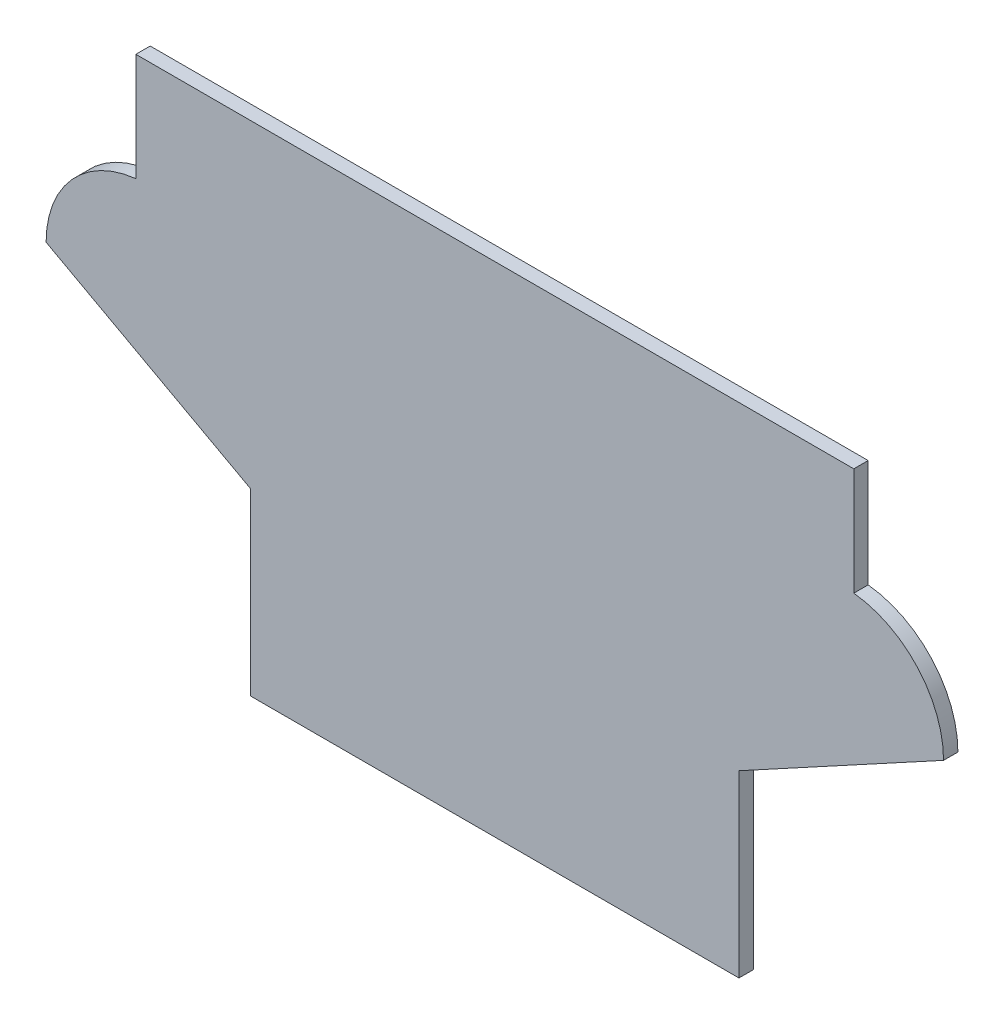
ISO-10303-21;
HEADER;
FILE_DESCRIPTION(('STEP AP214'),'2;1');
FILE_NAME('part.step','',(''),(''),'','','');
FILE_SCHEMA(('AUTOMOTIVE_DESIGN { 1 0 10303 214 1 1 1 1 }'));
ENDSEC;
DATA;
#1=APPLICATION_CONTEXT('core data for automotive mechanical design processes');
#2=APPLICATION_PROTOCOL_DEFINITION('international standard','automotive_design',2000,#1);
#3=PRODUCT_CONTEXT('',#1,'mechanical');
#4=PRODUCT('Part','Part','',(#3));
#5=PRODUCT_RELATED_PRODUCT_CATEGORY('part','',(#4));
#6=PRODUCT_DEFINITION_FORMATION('','',#4);
#7=PRODUCT_DEFINITION_CONTEXT('part definition',#1,'design');
#8=PRODUCT_DEFINITION('design','',#6,#7);
#9=PRODUCT_DEFINITION_SHAPE('','',#8);
#10=(LENGTH_UNIT() NAMED_UNIT(*) SI_UNIT(.MILLI.,.METRE.));
#11=(NAMED_UNIT(*) PLANE_ANGLE_UNIT() SI_UNIT($,.RADIAN.));
#12=(NAMED_UNIT(*) SI_UNIT($,.STERADIAN.) SOLID_ANGLE_UNIT());
#13=UNCERTAINTY_MEASURE_WITH_UNIT(LENGTH_MEASURE(1.E-05),#10,'distance_accuracy_value','');
#14=(GEOMETRIC_REPRESENTATION_CONTEXT(3) GLOBAL_UNCERTAINTY_ASSIGNED_CONTEXT((#13)) GLOBAL_UNIT_ASSIGNED_CONTEXT((#10,
#11,#12)) REPRESENTATION_CONTEXT('',''));
#15=CARTESIAN_POINT('',(0.,0.,0.));
#16=DIRECTION('',(0.,0.,1.));
#17=DIRECTION('',(1.,0.,0.));
#18=AXIS2_PLACEMENT_3D('',#15,#16,#17);
#19=CARTESIAN_POINT('',(500.,544.194109070751,20.));
#20=DIRECTION('',(-1.,0.,0.));
#21=DIRECTION('',(0.,0.,1.));
#22=AXIS2_PLACEMENT_3D('',#19,#20,#21);
#23=PLANE('',#22);
#24=DIRECTION('',(0.,1.,0.));
#25=VECTOR('',#24,1.);
#26=CARTESIAN_POINT('',(500.,544.194109070751,0.));
#27=LINE('',#26,#25);
#28=CARTESIAN_POINT('',(500.,544.194109070751,0.));
#29=VERTEX_POINT('',#28);
#30=CARTESIAN_POINT('',(500.,694.194109070751,0.));
#31=VERTEX_POINT('',#30);
#32=EDGE_CURVE('E142',#29,#31,#27,.T.);
#33=ORIENTED_EDGE('',*,*,#32,.T.);
#34=DIRECTION('',(0.,0.,-1.));
#35=VECTOR('',#34,1.);
#36=CARTESIAN_POINT('',(500.,694.194109070751,20.));
#37=LINE('',#36,#35);
#38=CARTESIAN_POINT('',(500.,694.194109070751,20.));
#39=VERTEX_POINT('',#38);
#40=EDGE_CURVE('E11',#39,#31,#37,.T.);
#41=ORIENTED_EDGE('',*,*,#40,.F.);
#42=DIRECTION('',(0.,1.,0.));
#43=VECTOR('',#42,1.);
#44=CARTESIAN_POINT('',(500.,544.194109070751,20.));
#45=LINE('',#44,#43);
#46=CARTESIAN_POINT('',(500.,544.194109070751,20.));
#47=VERTEX_POINT('',#46);
#48=EDGE_CURVE('E93',#47,#39,#45,.T.);
#49=ORIENTED_EDGE('',*,*,#48,.F.);
#50=DIRECTION('',(0.,0.,-1.));
#51=VECTOR('',#50,1.);
#52=CARTESIAN_POINT('',(500.,544.194109070751,20.));
#53=LINE('',#52,#51);
#54=EDGE_CURVE('E50',#47,#29,#53,.T.);
#55=ORIENTED_EDGE('',*,*,#54,.T.);
#56=EDGE_LOOP('',(#33,#41,#49,#55));
#57=FACE_BOUND('',#56,.T.);
#58=ADVANCED_FACE('F34',(#57),#23,.F.);
#59=CARTESIAN_POINT('',(-500.,694.194109070751,20.));
#60=DIRECTION('',(0.,1.,0.));
#61=DIRECTION('',(-1.,0.,0.));
#62=AXIS2_PLACEMENT_3D('',#59,#60,#61);
#63=PLANE('',#62);
#64=DIRECTION('',(1.,0.,0.));
#65=VECTOR('',#64,1.);
#66=CARTESIAN_POINT('',(-500.,694.194109070751,0.));
#67=LINE('',#66,#65);
#68=CARTESIAN_POINT('',(-500.,694.194109070751,0.));
#69=VERTEX_POINT('',#68);
#70=EDGE_CURVE('E144',#69,#31,#67,.T.);
#71=ORIENTED_EDGE('',*,*,#70,.F.);
#72=DIRECTION('',(0.,0.,-1.));
#73=VECTOR('',#72,1.);
#74=CARTESIAN_POINT('',(-500.,694.194109070751,20.));
#75=LINE('',#74,#73);
#76=CARTESIAN_POINT('',(-500.,694.194109070751,20.));
#77=VERTEX_POINT('',#76);
#78=EDGE_CURVE('E42',#77,#69,#75,.T.);
#79=ORIENTED_EDGE('',*,*,#78,.F.);
#80=DIRECTION('',(1.,0.,0.));
#81=VECTOR('',#80,1.);
#82=CARTESIAN_POINT('',(-500.,694.194109070751,20.));
#83=LINE('',#82,#81);
#84=EDGE_CURVE('E208',#77,#39,#83,.T.);
#85=ORIENTED_EDGE('',*,*,#84,.T.);
#86=ORIENTED_EDGE('',*,*,#40,.T.);
#87=EDGE_LOOP('',(#71,#79,#85,#86));
#88=FACE_BOUND('',#87,.T.);
#89=ADVANCED_FACE('F186',(#88),#63,.T.);
#90=CARTESIAN_POINT('',(-500.,544.194109070751,20.));
#91=DIRECTION('',(-1.,0.,0.));
#92=DIRECTION('',(0.,0.,1.));
#93=AXIS2_PLACEMENT_3D('',#90,#91,#92);
#94=PLANE('',#93);
#95=DIRECTION('',(0.,1.,0.));
#96=VECTOR('',#95,1.);
#97=CARTESIAN_POINT('',(-500.,544.194109070751,0.));
#98=LINE('',#97,#96);
#99=CARTESIAN_POINT('',(-500.,544.194109070751,0.));
#100=VERTEX_POINT('',#99);
#101=EDGE_CURVE('E147',#100,#69,#98,.T.);
#102=ORIENTED_EDGE('',*,*,#101,.F.);
#103=DIRECTION('',(0.,0.,-1.));
#104=VECTOR('',#103,1.);
#105=CARTESIAN_POINT('',(-500.,544.194109070751,20.));
#106=LINE('',#105,#104);
#107=CARTESIAN_POINT('',(-500.,544.194109070751,20.));
#108=VERTEX_POINT('',#107);
#109=EDGE_CURVE('E176',#108,#100,#106,.T.);
#110=ORIENTED_EDGE('',*,*,#109,.F.);
#111=DIRECTION('',(0.,1.,0.));
#112=VECTOR('',#111,1.);
#113=CARTESIAN_POINT('',(-500.,544.194109070751,20.));
#114=LINE('',#113,#112);
#115=EDGE_CURVE('E183',#108,#77,#114,.T.);
#116=ORIENTED_EDGE('',*,*,#115,.T.);
#117=ORIENTED_EDGE('',*,*,#78,.T.);
#118=EDGE_LOOP('',(#102,#110,#116,#117));
#119=FACE_BOUND('',#118,.T.);
#120=ADVANCED_FACE('F181',(#119),#94,.T.);
#121=CARTESIAN_POINT('',(-485.,405.,20.));
#122=DIRECTION('',(0.,0.,-1.));
#123=DIRECTION('',(-1.,0.,0.));
#124=AXIS2_PLACEMENT_3D('',#121,#122,#123);
#125=CYLINDRICAL_SURFACE('',#124,140.);
#126=CARTESIAN_POINT('',(-485.,405.,0.));
#127=DIRECTION('',(0.,0.,1.));
#128=DIRECTION('',(1.,0.,0.));
#129=AXIS2_PLACEMENT_3D('',#126,#127,#128);
#130=CIRCLE('',#129,140.);
#131=CARTESIAN_POINT('',(-625.,405.,0.));
#132=VERTEX_POINT('',#131);
#133=EDGE_CURVE('E150',#100,#132,#130,.T.);
#134=ORIENTED_EDGE('',*,*,#133,.T.);
#135=DIRECTION('',(0.,0.,-1.));
#136=VECTOR('',#135,1.);
#137=CARTESIAN_POINT('',(-625.,405.,20.));
#138=LINE('',#137,#136);
#139=CARTESIAN_POINT('',(-625.,405.,20.));
#140=VERTEX_POINT('',#139);
#141=EDGE_CURVE('E173',#140,#132,#138,.T.);
#142=ORIENTED_EDGE('',*,*,#141,.F.);
#143=CARTESIAN_POINT('',(-485.,405.,20.));
#144=DIRECTION('',(0.,0.,1.));
#145=DIRECTION('',(1.,0.,0.));
#146=AXIS2_PLACEMENT_3D('',#143,#144,#145);
#147=CIRCLE('',#146,140.);
#148=EDGE_CURVE('E202',#108,#140,#147,.T.);
#149=ORIENTED_EDGE('',*,*,#148,.F.);
#150=ORIENTED_EDGE('',*,*,#109,.T.);
#151=EDGE_LOOP('',(#134,#142,#149,#150));
#152=FACE_BOUND('',#151,.T.);
#153=ADVANCED_FACE('F193',(#152),#125,.T.);
#154=CARTESIAN_POINT('',(-625.,405.,20.));
#155=DIRECTION('',(0.477771946909984,0.878483902382874,0.));
#156=DIRECTION('',(-0.878483902382874,0.477771946909984,0.));
#157=AXIS2_PLACEMENT_3D('',#154,#155,#156);
#158=PLANE('',#157);
#159=DIRECTION('',(0.878483902382874,-0.477771946909984,0.));
#160=VECTOR('',#159,1.);
#161=CARTESIAN_POINT('',(-625.,405.,0.));
#162=LINE('',#161,#160);
#163=CARTESIAN_POINT('',(-340.,250.,0.));
#164=VERTEX_POINT('',#163);
#165=EDGE_CURVE('E152',#132,#164,#162,.T.);
#166=ORIENTED_EDGE('',*,*,#165,.T.);
#167=DIRECTION('',(0.,0.,-1.));
#168=VECTOR('',#167,1.);
#169=CARTESIAN_POINT('',(-340.,250.,20.));
#170=LINE('',#169,#168);
#171=CARTESIAN_POINT('',(-340.,250.,20.));
#172=VERTEX_POINT('',#171);
#173=EDGE_CURVE('E171',#172,#164,#170,.T.);
#174=ORIENTED_EDGE('',*,*,#173,.F.);
#175=DIRECTION('',(0.878483902382874,-0.477771946909984,0.));
#176=VECTOR('',#175,1.);
#177=CARTESIAN_POINT('',(-625.,405.,20.));
#178=LINE('',#177,#176);
#179=EDGE_CURVE('E199',#140,#172,#178,.T.);
#180=ORIENTED_EDGE('',*,*,#179,.F.);
#181=ORIENTED_EDGE('',*,*,#141,.T.);
#182=EDGE_LOOP('',(#166,#174,#180,#181));
#183=FACE_BOUND('',#182,.T.);
#184=ADVANCED_FACE('F197',(#183),#158,.F.);
#185=CARTESIAN_POINT('',(-340.,0.,20.));
#186=DIRECTION('',(-1.,0.,0.));
#187=DIRECTION('',(0.,0.,1.));
#188=AXIS2_PLACEMENT_3D('',#185,#186,#187);
#189=PLANE('',#188);
#190=DIRECTION('',(0.,1.,0.));
#191=VECTOR('',#190,1.);
#192=CARTESIAN_POINT('',(-340.,0.,0.));
#193=LINE('',#192,#191);
#194=CARTESIAN_POINT('',(-340.,0.,0.));
#195=VERTEX_POINT('',#194);
#196=EDGE_CURVE('E155',#195,#164,#193,.T.);
#197=ORIENTED_EDGE('',*,*,#196,.F.);
#198=DIRECTION('',(0.,0.,-1.));
#199=VECTOR('',#198,1.);
#200=CARTESIAN_POINT('',(-340.,0.,20.));
#201=LINE('',#200,#199);
#202=CARTESIAN_POINT('',(-340.,0.,20.));
#203=VERTEX_POINT('',#202);
#204=EDGE_CURVE('E169',#203,#195,#201,.T.);
#205=ORIENTED_EDGE('',*,*,#204,.F.);
#206=DIRECTION('',(0.,1.,0.));
#207=VECTOR('',#206,1.);
#208=CARTESIAN_POINT('',(-340.,0.,20.));
#209=LINE('',#208,#207);
#210=EDGE_CURVE('E201',#203,#172,#209,.T.);
#211=ORIENTED_EDGE('',*,*,#210,.T.);
#212=ORIENTED_EDGE('',*,*,#173,.T.);
#213=EDGE_LOOP('',(#197,#205,#211,#212));
#214=FACE_BOUND('',#213,.T.);
#215=ADVANCED_FACE('F212',(#214),#189,.T.);
#216=CARTESIAN_POINT('',(-340.,0.,20.));
#217=DIRECTION('',(0.,1.,0.));
#218=DIRECTION('',(-1.,0.,0.));
#219=AXIS2_PLACEMENT_3D('',#216,#217,#218);
#220=PLANE('',#219);
#221=DIRECTION('',(1.,0.,0.));
#222=VECTOR('',#221,1.);
#223=CARTESIAN_POINT('',(-340.,0.,0.));
#224=LINE('',#223,#222);
#225=CARTESIAN_POINT('',(340.,0.,0.));
#226=VERTEX_POINT('',#225);
#227=EDGE_CURVE('E158',#195,#226,#224,.T.);
#228=ORIENTED_EDGE('',*,*,#227,.T.);
#229=DIRECTION('',(0.,0.,-1.));
#230=VECTOR('',#229,1.);
#231=CARTESIAN_POINT('',(340.,0.,20.));
#232=LINE('',#231,#230);
#233=CARTESIAN_POINT('',(340.,0.,20.));
#234=VERTEX_POINT('',#233);
#235=EDGE_CURVE('E134',#234,#226,#232,.T.);
#236=ORIENTED_EDGE('',*,*,#235,.F.);
#237=DIRECTION('',(1.,0.,0.));
#238=VECTOR('',#237,1.);
#239=CARTESIAN_POINT('',(-340.,0.,20.));
#240=LINE('',#239,#238);
#241=EDGE_CURVE('E122',#203,#234,#240,.T.);
#242=ORIENTED_EDGE('',*,*,#241,.F.);
#243=ORIENTED_EDGE('',*,*,#204,.T.);
#244=EDGE_LOOP('',(#228,#236,#242,#243));
#245=FACE_BOUND('',#244,.T.);
#246=ADVANCED_FACE('F215',(#245),#220,.F.);
#247=CARTESIAN_POINT('',(340.,0.,20.));
#248=DIRECTION('',(-1.,0.,0.));
#249=DIRECTION('',(0.,0.,1.));
#250=AXIS2_PLACEMENT_3D('',#247,#248,#249);
#251=PLANE('',#250);
#252=DIRECTION('',(0.,1.,0.));
#253=VECTOR('',#252,1.);
#254=CARTESIAN_POINT('',(340.,0.,0.));
#255=LINE('',#254,#253);
#256=CARTESIAN_POINT('',(340.,250.,0.));
#257=VERTEX_POINT('',#256);
#258=EDGE_CURVE('E131',#226,#257,#255,.T.);
#259=ORIENTED_EDGE('',*,*,#258,.T.);
#260=DIRECTION('',(0.,0.,-1.));
#261=VECTOR('',#260,1.);
#262=CARTESIAN_POINT('',(340.,250.,20.));
#263=LINE('',#262,#261);
#264=CARTESIAN_POINT('',(340.,250.,20.));
#265=VERTEX_POINT('',#264);
#266=EDGE_CURVE('E128',#265,#257,#263,.T.);
#267=ORIENTED_EDGE('',*,*,#266,.F.);
#268=DIRECTION('',(0.,1.,0.));
#269=VECTOR('',#268,1.);
#270=CARTESIAN_POINT('',(340.,0.,20.));
#271=LINE('',#270,#269);
#272=EDGE_CURVE('E115',#234,#265,#271,.T.);
#273=ORIENTED_EDGE('',*,*,#272,.F.);
#274=ORIENTED_EDGE('',*,*,#235,.T.);
#275=EDGE_LOOP('',(#259,#267,#273,#274));
#276=FACE_BOUND('',#275,.T.);
#277=ADVANCED_FACE('F129',(#276),#251,.F.);
#278=CARTESIAN_POINT('',(625.,405.,20.));
#279=DIRECTION('',(0.477771946909985,-0.878483902382874,0.));
#280=DIRECTION('',(0.878483902382874,0.477771946909985,0.));
#281=AXIS2_PLACEMENT_3D('',#278,#279,#280);
#282=PLANE('',#281);
#283=DIRECTION('',(-0.878483902382874,-0.477771946909985,0.));
#284=VECTOR('',#283,1.);
#285=CARTESIAN_POINT('',(625.,405.,0.));
#286=LINE('',#285,#284);
#287=CARTESIAN_POINT('',(625.,405.,0.));
#288=VERTEX_POINT('',#287);
#289=EDGE_CURVE('E161',#288,#257,#286,.T.);
#290=ORIENTED_EDGE('',*,*,#289,.F.);
#291=DIRECTION('',(0.,0.,-1.));
#292=VECTOR('',#291,1.);
#293=CARTESIAN_POINT('',(625.,405.,20.));
#294=LINE('',#293,#292);
#295=CARTESIAN_POINT('',(625.,405.,20.));
#296=VERTEX_POINT('',#295);
#297=EDGE_CURVE('E81',#296,#288,#294,.T.);
#298=ORIENTED_EDGE('',*,*,#297,.F.);
#299=DIRECTION('',(-0.878483902382874,-0.477771946909985,0.));
#300=VECTOR('',#299,1.);
#301=CARTESIAN_POINT('',(625.,405.,20.));
#302=LINE('',#301,#300);
#303=EDGE_CURVE('E119',#296,#265,#302,.T.);
#304=ORIENTED_EDGE('',*,*,#303,.T.);
#305=ORIENTED_EDGE('',*,*,#266,.T.);
#306=EDGE_LOOP('',(#290,#298,#304,#305));
#307=FACE_BOUND('',#306,.T.);
#308=ADVANCED_FACE('F136',(#307),#282,.T.);
#309=CARTESIAN_POINT('',(485.,405.,20.));
#310=DIRECTION('',(0.,0.,-1.));
#311=DIRECTION('',(-1.,0.,0.));
#312=AXIS2_PLACEMENT_3D('',#309,#310,#311);
#313=CYLINDRICAL_SURFACE('',#312,140.);
#314=CARTESIAN_POINT('',(485.,405.,0.));
#315=DIRECTION('',(0.,0.,-1.));
#316=DIRECTION('',(-1.,0.,0.));
#317=AXIS2_PLACEMENT_3D('',#314,#315,#316);
#318=CIRCLE('',#317,140.);
#319=EDGE_CURVE('E163',#29,#288,#318,.T.);
#320=ORIENTED_EDGE('',*,*,#319,.F.);
#321=ORIENTED_EDGE('',*,*,#54,.F.);
#322=CARTESIAN_POINT('',(485.,405.,20.));
#323=DIRECTION('',(0.,0.,-1.));
#324=DIRECTION('',(-1.,0.,0.));
#325=AXIS2_PLACEMENT_3D('',#322,#323,#324);
#326=CIRCLE('',#325,140.);
#327=EDGE_CURVE('E137',#47,#296,#326,.T.);
#328=ORIENTED_EDGE('',*,*,#327,.T.);
#329=ORIENTED_EDGE('',*,*,#297,.T.);
#330=EDGE_LOOP('',(#320,#321,#328,#329));
#331=FACE_BOUND('',#330,.T.);
#332=ADVANCED_FACE('F216',(#331),#313,.T.);
#333=CARTESIAN_POINT('',(-485.,405.,20.));
#334=DIRECTION('',(0.,0.,1.));
#335=DIRECTION('',(1.,0.,0.));
#336=AXIS2_PLACEMENT_3D('',#333,#334,#335);
#337=PLANE('',#336);
#338=ORIENTED_EDGE('',*,*,#48,.T.);
#339=ORIENTED_EDGE('',*,*,#84,.F.);
#340=ORIENTED_EDGE('',*,*,#115,.F.);
#341=ORIENTED_EDGE('',*,*,#148,.T.);
#342=ORIENTED_EDGE('',*,*,#179,.T.);
#343=ORIENTED_EDGE('',*,*,#210,.F.);
#344=ORIENTED_EDGE('',*,*,#241,.T.);
#345=ORIENTED_EDGE('',*,*,#272,.T.);
#346=ORIENTED_EDGE('',*,*,#303,.F.);
#347=ORIENTED_EDGE('',*,*,#327,.F.);
#348=EDGE_LOOP('',(#338,#339,#340,#341,#342,#343,#344,#345,#346,#347));
#349=FACE_BOUND('',#348,.T.);
#350=ADVANCED_FACE('F117',(#349),#337,.T.);
#351=CARTESIAN_POINT('',(-485.,405.,0.));
#352=DIRECTION('',(0.,0.,1.));
#353=DIRECTION('',(1.,0.,0.));
#354=AXIS2_PLACEMENT_3D('',#351,#352,#353);
#355=PLANE('',#354);
#356=ORIENTED_EDGE('',*,*,#32,.F.);
#357=ORIENTED_EDGE('',*,*,#319,.T.);
#358=ORIENTED_EDGE('',*,*,#289,.T.);
#359=ORIENTED_EDGE('',*,*,#258,.F.);
#360=ORIENTED_EDGE('',*,*,#227,.F.);
#361=ORIENTED_EDGE('',*,*,#196,.T.);
#362=ORIENTED_EDGE('',*,*,#165,.F.);
#363=ORIENTED_EDGE('',*,*,#133,.F.);
#364=ORIENTED_EDGE('',*,*,#101,.T.);
#365=ORIENTED_EDGE('',*,*,#70,.T.);
#366=EDGE_LOOP('',(#356,#357,#358,#359,#360,#361,#362,#363,#364,#365));
#367=FACE_BOUND('',#366,.T.);
#368=ADVANCED_FACE('F189',(#367),#355,.F.);
#369=CLOSED_SHELL('',(#58,#89,#120,#153,#184,#215,#246,#277,#308,#332,#350,#368));
#370=MANIFOLD_SOLID_BREP('B2',#369);
#371=ADVANCED_BREP_SHAPE_REPRESENTATION('',(#18,#370),#14);
#372=SHAPE_DEFINITION_REPRESENTATION(#9,#371);
ENDSEC;
END-ISO-10303-21;
